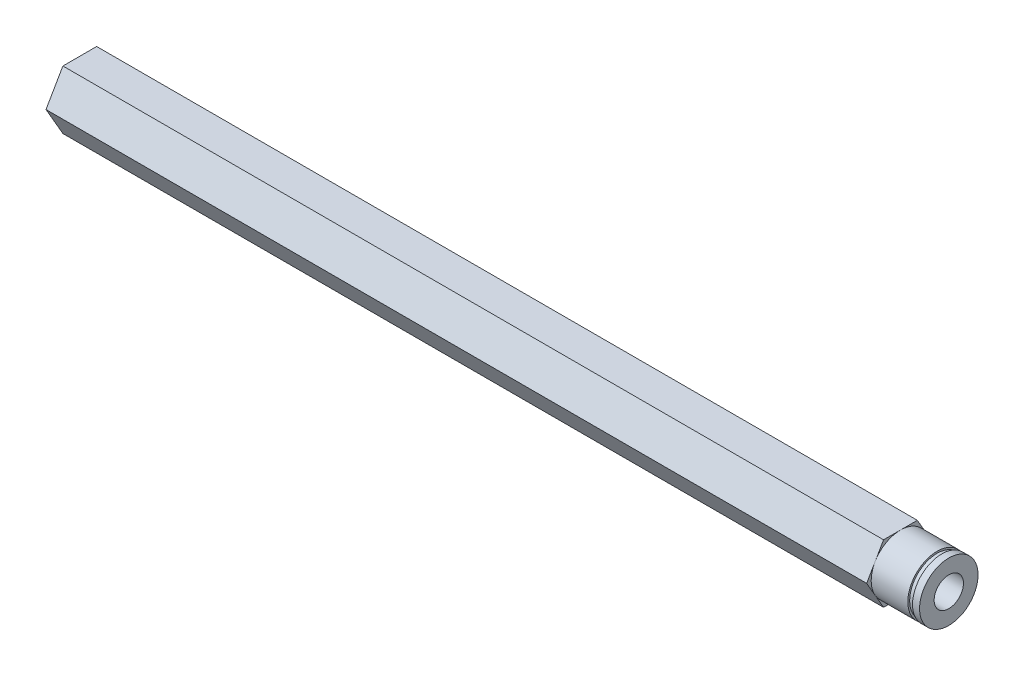
ISO-10303-21;
HEADER;
FILE_DESCRIPTION(('STEP AP214'),'2;1');
FILE_NAME('part.step','',(''),(''),'','','');
FILE_SCHEMA(('AUTOMOTIVE_DESIGN { 1 0 10303 214 1 1 1 1 }'));
ENDSEC;
DATA;
#1=APPLICATION_CONTEXT('core data for automotive mechanical design processes');
#2=APPLICATION_PROTOCOL_DEFINITION('international standard','automotive_design',2000,#1);
#3=PRODUCT_CONTEXT('',#1,'mechanical');
#4=PRODUCT('Part','Part','',(#3));
#5=PRODUCT_RELATED_PRODUCT_CATEGORY('part','',(#4));
#6=PRODUCT_DEFINITION_FORMATION('','',#4);
#7=PRODUCT_DEFINITION_CONTEXT('part definition',#1,'design');
#8=PRODUCT_DEFINITION('design','',#6,#7);
#9=PRODUCT_DEFINITION_SHAPE('','',#8);
#10=(LENGTH_UNIT() NAMED_UNIT(*) SI_UNIT(.MILLI.,.METRE.));
#11=(NAMED_UNIT(*) PLANE_ANGLE_UNIT() SI_UNIT($,.RADIAN.));
#12=(NAMED_UNIT(*) SI_UNIT($,.STERADIAN.) SOLID_ANGLE_UNIT());
#13=UNCERTAINTY_MEASURE_WITH_UNIT(LENGTH_MEASURE(1.E-05),#10,'distance_accuracy_value','');
#14=(GEOMETRIC_REPRESENTATION_CONTEXT(3) GLOBAL_UNCERTAINTY_ASSIGNED_CONTEXT((#13)) GLOBAL_UNIT_ASSIGNED_CONTEXT((#10,
#11,#12)) REPRESENTATION_CONTEXT('',''));
#15=CARTESIAN_POINT('',(0.,0.,0.));
#16=DIRECTION('',(0.,0.,1.));
#17=DIRECTION('',(1.,0.,0.));
#18=AXIS2_PLACEMENT_3D('',#15,#16,#17);
#19=CARTESIAN_POINT('',(-5.3975,0.,0.));
#20=DIRECTION('',(1.,0.,0.));
#21=DIRECTION('',(0.,0.,-1.));
#22=AXIS2_PLACEMENT_3D('',#19,#20,#21);
#23=PLANE('',#22);
#24=CARTESIAN_POINT('',(-5.3975,0.,0.));
#25=DIRECTION('',(1.,0.,0.));
#26=DIRECTION('',(0.,0.,-1.));
#27=AXIS2_PLACEMENT_3D('',#24,#25,#26);
#28=CIRCLE('',#27,3.175);
#29=CARTESIAN_POINT('',(-5.3975,0.,-3.175));
#30=VERTEX_POINT('',#29);
#31=EDGE_CURVE('E19',#30,#30,#28,.T.);
#32=ORIENTED_EDGE('',*,*,#31,.T.);
#33=EDGE_LOOP('',(#32));
#34=FACE_BOUND('',#33,.T.);
#35=ADVANCED_FACE('F16',(#34),#23,.T.);
#36=CARTESIAN_POINT('',(-5.3975,0.,0.));
#37=DIRECTION('',(1.,0.,0.));
#38=DIRECTION('',(0.,0.,-1.));
#39=AXIS2_PLACEMENT_3D('',#36,#37,#38);
#40=CYLINDRICAL_SURFACE('',#39,3.175);
#41=CARTESIAN_POINT('',(10.4775,0.,0.));
#42=DIRECTION('',(1.,0.,0.));
#43=DIRECTION('',(0.,0.,-1.));
#44=AXIS2_PLACEMENT_3D('',#41,#42,#43);
#45=CIRCLE('',#44,3.175);
#46=CARTESIAN_POINT('',(10.4775,0.,-3.175));
#47=VERTEX_POINT('',#46);
#48=EDGE_CURVE('E180',#47,#47,#45,.F.);
#49=ORIENTED_EDGE('',*,*,#48,.F.);
#50=EDGE_LOOP('',(#49));
#51=FACE_BOUND('',#50,.T.);
#52=ORIENTED_EDGE('',*,*,#31,.F.);
#53=EDGE_LOOP('',(#52));
#54=FACE_BOUND('',#53,.T.);
#55=ADVANCED_FACE('F192',(#51,#54),#40,.F.);
#56=CARTESIAN_POINT('',(10.4775,0.,0.));
#57=DIRECTION('',(1.,0.,0.));
#58=DIRECTION('',(0.,0.,-1.));
#59=AXIS2_PLACEMENT_3D('',#56,#57,#58);
#60=PLANE('',#59);
#61=CARTESIAN_POINT('',(10.4775,0.,0.));
#62=DIRECTION('',(-1.,0.,0.));
#63=DIRECTION('',(0.,0.,1.));
#64=AXIS2_PLACEMENT_3D('',#61,#62,#63);
#65=CIRCLE('',#64,6.3373);
#66=CARTESIAN_POINT('',(10.4775,0.,6.3373));
#67=VERTEX_POINT('',#66);
#68=EDGE_CURVE('E177',#67,#67,#65,.T.);
#69=ORIENTED_EDGE('',*,*,#68,.F.);
#70=EDGE_LOOP('',(#69));
#71=FACE_BOUND('',#70,.T.);
#72=ORIENTED_EDGE('',*,*,#48,.T.);
#73=EDGE_LOOP('',(#72));
#74=FACE_BOUND('',#73,.T.);
#75=ADVANCED_FACE('F194',(#71,#74),#60,.T.);
#76=CARTESIAN_POINT('',(10.4775,0.,0.));
#77=DIRECTION('',(-1.,0.,0.));
#78=DIRECTION('',(0.,0.,1.));
#79=AXIS2_PLACEMENT_3D('',#76,#77,#78);
#80=CYLINDRICAL_SURFACE('',#79,6.3373);
#81=ORIENTED_EDGE('',*,*,#68,.T.);
#82=EDGE_LOOP('',(#81));
#83=FACE_BOUND('',#82,.T.);
#84=CARTESIAN_POINT('',(8.9535,0.,0.));
#85=DIRECTION('',(-1.,0.,0.));
#86=DIRECTION('',(0.,0.,1.));
#87=AXIS2_PLACEMENT_3D('',#84,#85,#86);
#88=CIRCLE('',#87,6.3373);
#89=CARTESIAN_POINT('',(8.9535,0.,6.3373));
#90=VERTEX_POINT('',#89);
#91=EDGE_CURVE('E173',#90,#90,#88,.F.);
#92=ORIENTED_EDGE('',*,*,#91,.T.);
#93=EDGE_LOOP('',(#92));
#94=FACE_BOUND('',#93,.T.);
#95=ADVANCED_FACE('F201',(#83,#94),#80,.T.);
#96=CARTESIAN_POINT('',(8.9535,0.,0.));
#97=DIRECTION('',(1.,0.,0.));
#98=DIRECTION('',(0.,0.,-1.));
#99=AXIS2_PLACEMENT_3D('',#96,#97,#98);
#100=PLANE('',#99);
#101=ORIENTED_EDGE('',*,*,#91,.F.);
#102=EDGE_LOOP('',(#101));
#103=FACE_BOUND('',#102,.T.);
#104=CARTESIAN_POINT('',(8.9535,0.,0.));
#105=DIRECTION('',(-1.,0.,0.));
#106=DIRECTION('',(0.,0.,1.));
#107=AXIS2_PLACEMENT_3D('',#104,#105,#106);
#108=CIRCLE('',#107,5.9436);
#109=CARTESIAN_POINT('',(8.9535,0.,5.9436));
#110=VERTEX_POINT('',#109);
#111=EDGE_CURVE('E169',#110,#110,#108,.T.);
#112=ORIENTED_EDGE('',*,*,#111,.F.);
#113=EDGE_LOOP('',(#112));
#114=FACE_BOUND('',#113,.T.);
#115=ADVANCED_FACE('F263',(#103,#114),#100,.F.);
#116=CARTESIAN_POINT('',(8.9535,0.,0.));
#117=DIRECTION('',(-1.,0.,0.));
#118=DIRECTION('',(0.,0.,1.));
#119=AXIS2_PLACEMENT_3D('',#116,#117,#118);
#120=CYLINDRICAL_SURFACE('',#119,5.9436);
#121=CARTESIAN_POINT('',(7.9375,0.,0.));
#122=DIRECTION('',(-1.,0.,0.));
#123=DIRECTION('',(0.,0.,1.));
#124=AXIS2_PLACEMENT_3D('',#121,#122,#123);
#125=CIRCLE('',#124,5.9436);
#126=CARTESIAN_POINT('',(7.9375,0.,5.9436));
#127=VERTEX_POINT('',#126);
#128=EDGE_CURVE('E164',#127,#127,#125,.T.);
#129=ORIENTED_EDGE('',*,*,#128,.F.);
#130=EDGE_LOOP('',(#129));
#131=FACE_BOUND('',#130,.T.);
#132=ORIENTED_EDGE('',*,*,#111,.T.);
#133=EDGE_LOOP('',(#132));
#134=FACE_BOUND('',#133,.T.);
#135=ADVANCED_FACE('F260',(#131,#134),#120,.T.);
#136=CARTESIAN_POINT('',(0.,0.,0.));
#137=DIRECTION('',(-1.,0.,0.));
#138=DIRECTION('',(0.,0.,1.));
#139=AXIS2_PLACEMENT_3D('',#136,#137,#138);
#140=PLANE('',#139);
#141=DIRECTION('',(0.,0.866025403784439,0.499999999999999));
#142=VECTOR('',#141,1.);
#143=CARTESIAN_POINT('',(0.,-6.3373,3.65884186093542));
#144=LINE('',#143,#142);
#145=CARTESIAN_POINT('',(0.,-3.16865,5.48826279140312));
#146=VERTEX_POINT('',#145);
#147=CARTESIAN_POINT('',(0.,-6.3373,3.65884186093542));
#148=VERTEX_POINT('',#147);
#149=EDGE_CURVE('E78',#146,#148,#144,.F.);
#150=ORIENTED_EDGE('',*,*,#149,.T.);
#151=DIRECTION('',(0.,0.,1.));
#152=VECTOR('',#151,1.);
#153=CARTESIAN_POINT('',(0.,-6.3373,-3.65884186093542));
#154=LINE('',#153,#152);
#155=CARTESIAN_POINT('',(0.,-6.3373,0.));
#156=VERTEX_POINT('',#155);
#157=EDGE_CURVE('E70',#148,#156,#154,.F.);
#158=ORIENTED_EDGE('',*,*,#157,.T.);
#159=CARTESIAN_POINT('',(0.,0.,0.));
#160=DIRECTION('',(-1.,0.,0.));
#161=DIRECTION('',(0.,0.,1.));
#162=AXIS2_PLACEMENT_3D('',#159,#160,#161);
#163=CIRCLE('',#162,6.3373);
#164=EDGE_CURVE('E160',#146,#156,#163,.F.);
#165=ORIENTED_EDGE('',*,*,#164,.F.);
#166=EDGE_LOOP('',(#150,#158,#165));
#167=FACE_BOUND('',#166,.T.);
#168=ADVANCED_FACE('F256',(#167),#140,.F.);
#169=CARTESIAN_POINT('',(7.9375,0.,0.));
#170=DIRECTION('',(1.,0.,0.));
#171=DIRECTION('',(0.,0.,-1.));
#172=AXIS2_PLACEMENT_3D('',#169,#170,#171);
#173=PLANE('',#172);
#174=CARTESIAN_POINT('',(7.9375,0.,0.));
#175=DIRECTION('',(-1.,0.,0.));
#176=DIRECTION('',(0.,0.,1.));
#177=AXIS2_PLACEMENT_3D('',#174,#175,#176);
#178=CIRCLE('',#177,6.3373);
#179=CARTESIAN_POINT('',(7.9375,0.,6.3373));
#180=VERTEX_POINT('',#179);
#181=EDGE_CURVE('E153',#180,#180,#178,.T.);
#182=ORIENTED_EDGE('',*,*,#181,.F.);
#183=EDGE_LOOP('',(#182));
#184=FACE_BOUND('',#183,.T.);
#185=ORIENTED_EDGE('',*,*,#128,.T.);
#186=EDGE_LOOP('',(#185));
#187=FACE_BOUND('',#186,.T.);
#188=ADVANCED_FACE('F252',(#184,#187),#173,.T.);
#189=CARTESIAN_POINT('',(0.,0.,0.));
#190=DIRECTION('',(-1.,0.,0.));
#191=DIRECTION('',(0.,0.,1.));
#192=AXIS2_PLACEMENT_3D('',#189,#190,#191);
#193=PLANE('',#192);
#194=DIRECTION('',(0.,0.866025403784439,-0.5));
#195=VECTOR('',#194,1.);
#196=CARTESIAN_POINT('',(0.,0.,7.31768372187083));
#197=LINE('',#196,#195);
#198=CARTESIAN_POINT('',(0.,3.16865,5.48826279140312));
#199=VERTEX_POINT('',#198);
#200=CARTESIAN_POINT('',(0.,0.,7.31768372187083));
#201=VERTEX_POINT('',#200);
#202=EDGE_CURVE('E423',#199,#201,#197,.F.);
#203=ORIENTED_EDGE('',*,*,#202,.T.);
#204=DIRECTION('',(0.,0.866025403784439,0.499999999999999));
#205=VECTOR('',#204,1.);
#206=CARTESIAN_POINT('',(0.,-6.3373,3.65884186093542));
#207=LINE('',#206,#205);
#208=EDGE_CURVE('E168',#201,#146,#207,.F.);
#209=ORIENTED_EDGE('',*,*,#208,.T.);
#210=CARTESIAN_POINT('',(0.,0.,0.));
#211=DIRECTION('',(-1.,0.,0.));
#212=DIRECTION('',(0.,0.,1.));
#213=AXIS2_PLACEMENT_3D('',#210,#211,#212);
#214=CIRCLE('',#213,6.3373);
#215=EDGE_CURVE('E145',#199,#146,#214,.F.);
#216=ORIENTED_EDGE('',*,*,#215,.F.);
#217=EDGE_LOOP('',(#203,#209,#216));
#218=FACE_BOUND('',#217,.T.);
#219=ADVANCED_FACE('F248',(#218),#193,.F.);
#220=CARTESIAN_POINT('',(0.,0.,0.));
#221=DIRECTION('',(-1.,0.,0.));
#222=DIRECTION('',(0.,0.,1.));
#223=AXIS2_PLACEMENT_3D('',#220,#221,#222);
#224=PLANE('',#223);
#225=DIRECTION('',(0.,0.,-1.));
#226=VECTOR('',#225,1.);
#227=CARTESIAN_POINT('',(0.,6.3373,3.65884186093541));
#228=LINE('',#227,#226);
#229=CARTESIAN_POINT('',(0.,6.3373,0.));
#230=VERTEX_POINT('',#229);
#231=CARTESIAN_POINT('',(0.,6.3373,3.65884186093541));
#232=VERTEX_POINT('',#231);
#233=EDGE_CURVE('E128',#230,#232,#228,.F.);
#234=ORIENTED_EDGE('',*,*,#233,.T.);
#235=DIRECTION('',(0.,0.866025403784439,-0.5));
#236=VECTOR('',#235,1.);
#237=CARTESIAN_POINT('',(0.,0.,7.31768372187083));
#238=LINE('',#237,#236);
#239=EDGE_CURVE('E440',#232,#199,#238,.F.);
#240=ORIENTED_EDGE('',*,*,#239,.T.);
#241=CARTESIAN_POINT('',(0.,0.,0.));
#242=DIRECTION('',(-1.,0.,0.));
#243=DIRECTION('',(0.,0.,1.));
#244=AXIS2_PLACEMENT_3D('',#241,#242,#243);
#245=CIRCLE('',#244,6.3373);
#246=EDGE_CURVE('E150',#230,#199,#245,.F.);
#247=ORIENTED_EDGE('',*,*,#246,.F.);
#248=EDGE_LOOP('',(#234,#240,#247));
#249=FACE_BOUND('',#248,.T.);
#250=ADVANCED_FACE('F244',(#249),#224,.F.);
#251=CARTESIAN_POINT('',(-177.8,-6.3373,3.65884186093542));
#252=DIRECTION('',(0.,0.499999999999999,-0.866025403784439));
#253=DIRECTION('',(0.,0.866025403784439,0.499999999999999));
#254=AXIS2_PLACEMENT_3D('',#251,#252,#253);
#255=PLANE('',#254);
#256=ORIENTED_EDGE('',*,*,#208,.F.);
#257=DIRECTION('',(1.,0.,0.));
#258=VECTOR('',#257,1.);
#259=CARTESIAN_POINT('',(-177.8,0.,7.31768372187083));
#260=LINE('',#259,#258);
#261=CARTESIAN_POINT('',(-177.8,0.,7.31768372187083));
#262=VERTEX_POINT('',#261);
#263=EDGE_CURVE('E445',#201,#262,#260,.F.);
#264=ORIENTED_EDGE('',*,*,#263,.T.);
#265=DIRECTION('',(0.,0.866025403784439,0.499999999999999));
#266=VECTOR('',#265,1.);
#267=CARTESIAN_POINT('',(-177.8,-6.3373,3.65884186093542));
#268=LINE('',#267,#266);
#269=CARTESIAN_POINT('',(-177.8,-6.3373,3.65884186093542));
#270=VERTEX_POINT('',#269);
#271=EDGE_CURVE('E499',#270,#262,#268,.T.);
#272=ORIENTED_EDGE('',*,*,#271,.F.);
#273=DIRECTION('',(1.,0.,0.));
#274=VECTOR('',#273,1.);
#275=CARTESIAN_POINT('',(-177.8,-6.3373,3.65884186093542));
#276=LINE('',#275,#274);
#277=EDGE_CURVE('E418',#270,#148,#276,.T.);
#278=ORIENTED_EDGE('',*,*,#277,.T.);
#279=ORIENTED_EDGE('',*,*,#149,.F.);
#280=EDGE_LOOP('',(#256,#264,#272,#278,#279));
#281=FACE_BOUND('',#280,.T.);
#282=ADVANCED_FACE('F241',(#281),#255,.F.);
#283=CARTESIAN_POINT('',(-177.8,0.,7.31768372187083));
#284=DIRECTION('',(0.,-0.5,-0.866025403784439));
#285=DIRECTION('',(0.,0.866025403784439,-0.5));
#286=AXIS2_PLACEMENT_3D('',#283,#284,#285);
#287=PLANE('',#286);
#288=ORIENTED_EDGE('',*,*,#239,.F.);
#289=DIRECTION('',(1.,0.,0.));
#290=VECTOR('',#289,1.);
#291=CARTESIAN_POINT('',(-177.8,6.3373,3.65884186093541));
#292=LINE('',#291,#290);
#293=CARTESIAN_POINT('',(-177.8,6.3373,3.65884186093541));
#294=VERTEX_POINT('',#293);
#295=EDGE_CURVE('E149',#232,#294,#292,.F.);
#296=ORIENTED_EDGE('',*,*,#295,.T.);
#297=DIRECTION('',(0.,0.866025403784438,-0.5));
#298=VECTOR('',#297,1.);
#299=CARTESIAN_POINT('',(-177.8,0.,7.31768372187083));
#300=LINE('',#299,#298);
#301=EDGE_CURVE('E495',#262,#294,#300,.T.);
#302=ORIENTED_EDGE('',*,*,#301,.F.);
#303=ORIENTED_EDGE('',*,*,#263,.F.);
#304=ORIENTED_EDGE('',*,*,#202,.F.);
#305=EDGE_LOOP('',(#288,#296,#302,#303,#304));
#306=FACE_BOUND('',#305,.T.);
#307=ADVANCED_FACE('F237',(#306),#287,.F.);
#308=CARTESIAN_POINT('',(-177.8,-6.3373,-3.65884186093542));
#309=DIRECTION('',(0.,1.,0.));
#310=DIRECTION('',(0.,0.,1.));
#311=AXIS2_PLACEMENT_3D('',#308,#309,#310);
#312=PLANE('',#311);
#313=ORIENTED_EDGE('',*,*,#157,.F.);
#314=ORIENTED_EDGE('',*,*,#277,.F.);
#315=DIRECTION('',(0.,0.,1.));
#316=VECTOR('',#315,1.);
#317=CARTESIAN_POINT('',(-177.8,-6.3373,0.));
#318=LINE('',#317,#316);
#319=CARTESIAN_POINT('',(-177.8,-6.3373,-3.65884186093541));
#320=VERTEX_POINT('',#319);
#321=EDGE_CURVE('E452',#320,#270,#318,.T.);
#322=ORIENTED_EDGE('',*,*,#321,.F.);
#323=DIRECTION('',(1.,0.,0.));
#324=VECTOR('',#323,1.);
#325=CARTESIAN_POINT('',(-177.8,-6.3373,-3.65884186093541));
#326=LINE('',#325,#324);
#327=CARTESIAN_POINT('',(0.,-6.3373,-3.65884186093541));
#328=VERTEX_POINT('',#327);
#329=EDGE_CURVE('E433',#320,#328,#326,.T.);
#330=ORIENTED_EDGE('',*,*,#329,.T.);
#331=DIRECTION('',(0.,0.,1.));
#332=VECTOR('',#331,1.);
#333=CARTESIAN_POINT('',(0.,-6.3373,0.));
#334=LINE('',#333,#332);
#335=EDGE_CURVE('E163',#328,#156,#334,.T.);
#336=ORIENTED_EDGE('',*,*,#335,.T.);
#337=EDGE_LOOP('',(#313,#314,#322,#330,#336));
#338=FACE_BOUND('',#337,.T.);
#339=ADVANCED_FACE('F233',(#338),#312,.F.);
#340=CARTESIAN_POINT('',(0.,0.,0.));
#341=DIRECTION('',(-1.,0.,0.));
#342=DIRECTION('',(0.,0.,1.));
#343=AXIS2_PLACEMENT_3D('',#340,#341,#342);
#344=PLANE('',#343);
#345=ORIENTED_EDGE('',*,*,#335,.F.);
#346=DIRECTION('',(0.,-0.866025403784439,0.5));
#347=VECTOR('',#346,1.);
#348=CARTESIAN_POINT('',(0.,0.,-7.31768372187083));
#349=LINE('',#348,#347);
#350=CARTESIAN_POINT('',(0.,-3.16865,-5.48826279140312));
#351=VERTEX_POINT('',#350);
#352=EDGE_CURVE('E437',#328,#351,#349,.F.);
#353=ORIENTED_EDGE('',*,*,#352,.T.);
#354=CARTESIAN_POINT('',(0.,0.,0.));
#355=DIRECTION('',(-1.,0.,0.));
#356=DIRECTION('',(0.,0.,1.));
#357=AXIS2_PLACEMENT_3D('',#354,#355,#356);
#358=CIRCLE('',#357,6.3373);
#359=EDGE_CURVE('E157',#156,#351,#358,.F.);
#360=ORIENTED_EDGE('',*,*,#359,.F.);
#361=EDGE_LOOP('',(#345,#353,#360));
#362=FACE_BOUND('',#361,.T.);
#363=ADVANCED_FACE('F230',(#362),#344,.F.);
#364=CARTESIAN_POINT('',(7.9375,0.,0.));
#365=DIRECTION('',(-1.,0.,0.));
#366=DIRECTION('',(0.,0.,1.));
#367=AXIS2_PLACEMENT_3D('',#364,#365,#366);
#368=CYLINDRICAL_SURFACE('',#367,6.3373);
#369=CARTESIAN_POINT('',(0.,0.,0.));
#370=DIRECTION('',(-1.,0.,0.));
#371=DIRECTION('',(0.,0.,1.));
#372=AXIS2_PLACEMENT_3D('',#369,#370,#371);
#373=CIRCLE('',#372,6.3373);
#374=CARTESIAN_POINT('',(0.,3.16865,-5.48826279140313));
#375=VERTEX_POINT('',#374);
#376=EDGE_CURVE('E39',#351,#375,#373,.F.);
#377=ORIENTED_EDGE('',*,*,#376,.T.);
#378=CARTESIAN_POINT('',(0.,0.,0.));
#379=DIRECTION('',(-1.,0.,0.));
#380=DIRECTION('',(0.,0.,1.));
#381=AXIS2_PLACEMENT_3D('',#378,#379,#380);
#382=CIRCLE('',#381,6.3373);
#383=EDGE_CURVE('E121',#375,#230,#382,.F.);
#384=ORIENTED_EDGE('',*,*,#383,.T.);
#385=ORIENTED_EDGE('',*,*,#246,.T.);
#386=ORIENTED_EDGE('',*,*,#215,.T.);
#387=ORIENTED_EDGE('',*,*,#164,.T.);
#388=ORIENTED_EDGE('',*,*,#359,.T.);
#389=EDGE_LOOP('',(#377,#384,#385,#386,#387,#388));
#390=FACE_BOUND('',#389,.T.);
#391=ORIENTED_EDGE('',*,*,#181,.T.);
#392=EDGE_LOOP('',(#391));
#393=FACE_BOUND('',#392,.T.);
#394=ADVANCED_FACE('F227',(#390,#393),#368,.T.);
#395=CARTESIAN_POINT('',(-177.8,6.3373,3.65884186093541));
#396=DIRECTION('',(0.,-1.,0.));
#397=DIRECTION('',(0.,0.,-1.));
#398=AXIS2_PLACEMENT_3D('',#395,#396,#397);
#399=PLANE('',#398);
#400=DIRECTION('',(0.,0.,1.));
#401=VECTOR('',#400,1.);
#402=CARTESIAN_POINT('',(0.,6.3373,0.));
#403=LINE('',#402,#401);
#404=CARTESIAN_POINT('',(0.,6.3373,-3.65884186093542));
#405=VERTEX_POINT('',#404);
#406=EDGE_CURVE('E124',#230,#405,#403,.F.);
#407=ORIENTED_EDGE('',*,*,#406,.T.);
#408=DIRECTION('',(1.,0.,0.));
#409=VECTOR('',#408,1.);
#410=CARTESIAN_POINT('',(-177.8,6.3373,-3.65884186093542));
#411=LINE('',#410,#409);
#412=CARTESIAN_POINT('',(-177.8,6.3373,-3.65884186093542));
#413=VERTEX_POINT('',#412);
#414=EDGE_CURVE('E110',#405,#413,#411,.F.);
#415=ORIENTED_EDGE('',*,*,#414,.T.);
#416=DIRECTION('',(0.,0.,1.));
#417=VECTOR('',#416,1.);
#418=CARTESIAN_POINT('',(-177.8,6.3373,0.));
#419=LINE('',#418,#417);
#420=EDGE_CURVE('E498',#294,#413,#419,.F.);
#421=ORIENTED_EDGE('',*,*,#420,.F.);
#422=ORIENTED_EDGE('',*,*,#295,.F.);
#423=ORIENTED_EDGE('',*,*,#233,.F.);
#424=EDGE_LOOP('',(#407,#415,#421,#422,#423));
#425=FACE_BOUND('',#424,.T.);
#426=ADVANCED_FACE('F125',(#425),#399,.F.);
#427=CARTESIAN_POINT('',(-177.8,0.,0.));
#428=DIRECTION('',(-1.,0.,0.));
#429=DIRECTION('',(0.,0.,1.));
#430=AXIS2_PLACEMENT_3D('',#427,#428,#429);
#431=PLANE('',#430);
#432=DIRECTION('',(0.,-0.866025403784439,0.5));
#433=VECTOR('',#432,1.);
#434=CARTESIAN_POINT('',(-177.8,0.,-7.31768372187083));
#435=LINE('',#434,#433);
#436=CARTESIAN_POINT('',(-177.8,0.,-7.31768372187083));
#437=VERTEX_POINT('',#436);
#438=EDGE_CURVE('E438',#437,#320,#435,.T.);
#439=ORIENTED_EDGE('',*,*,#438,.T.);
#440=ORIENTED_EDGE('',*,*,#321,.T.);
#441=ORIENTED_EDGE('',*,*,#271,.T.);
#442=ORIENTED_EDGE('',*,*,#301,.T.);
#443=ORIENTED_EDGE('',*,*,#420,.T.);
#444=DIRECTION('',(0.,-0.866025403784439,-0.5));
#445=VECTOR('',#444,1.);
#446=CARTESIAN_POINT('',(-177.8,6.3373,-3.65884186093542));
#447=LINE('',#446,#445);
#448=EDGE_CURVE('E117',#413,#437,#447,.T.);
#449=ORIENTED_EDGE('',*,*,#448,.T.);
#450=EDGE_LOOP('',(#439,#440,#441,#442,#443,#449));
#451=FACE_BOUND('',#450,.T.);
#452=ADVANCED_FACE('F221',(#451),#431,.T.);
#453=CARTESIAN_POINT('',(-177.8,0.,-7.31768372187083));
#454=DIRECTION('',(0.,0.5,0.866025403784439));
#455=DIRECTION('',(0.,-0.866025403784439,0.5));
#456=AXIS2_PLACEMENT_3D('',#453,#454,#455);
#457=PLANE('',#456);
#458=ORIENTED_EDGE('',*,*,#352,.F.);
#459=ORIENTED_EDGE('',*,*,#329,.F.);
#460=ORIENTED_EDGE('',*,*,#438,.F.);
#461=DIRECTION('',(1.,0.,0.));
#462=VECTOR('',#461,1.);
#463=CARTESIAN_POINT('',(-177.8,0.,-7.31768372187083));
#464=LINE('',#463,#462);
#465=CARTESIAN_POINT('',(0.,0.,-7.31768372187083));
#466=VERTEX_POINT('',#465);
#467=EDGE_CURVE('E427',#437,#466,#464,.T.);
#468=ORIENTED_EDGE('',*,*,#467,.T.);
#469=DIRECTION('',(0.,-0.866025403784438,0.5));
#470=VECTOR('',#469,1.);
#471=CARTESIAN_POINT('',(0.,0.,-7.31768372187083));
#472=LINE('',#471,#470);
#473=EDGE_CURVE('E144',#466,#351,#472,.T.);
#474=ORIENTED_EDGE('',*,*,#473,.T.);
#475=EDGE_LOOP('',(#458,#459,#460,#468,#474));
#476=FACE_BOUND('',#475,.T.);
#477=ADVANCED_FACE('F217',(#476),#457,.F.);
#478=CARTESIAN_POINT('',(0.,0.,0.));
#479=DIRECTION('',(-1.,0.,0.));
#480=DIRECTION('',(0.,0.,1.));
#481=AXIS2_PLACEMENT_3D('',#478,#479,#480);
#482=PLANE('',#481);
#483=ORIENTED_EDGE('',*,*,#473,.F.);
#484=DIRECTION('',(0.,-0.866025403784439,-0.5));
#485=VECTOR('',#484,1.);
#486=CARTESIAN_POINT('',(0.,6.3373,-3.65884186093542));
#487=LINE('',#486,#485);
#488=EDGE_CURVE('E26',#466,#375,#487,.F.);
#489=ORIENTED_EDGE('',*,*,#488,.T.);
#490=ORIENTED_EDGE('',*,*,#376,.F.);
#491=EDGE_LOOP('',(#483,#489,#490));
#492=FACE_BOUND('',#491,.T.);
#493=ADVANCED_FACE('F212',(#492),#482,.F.);
#494=CARTESIAN_POINT('',(0.,0.,0.));
#495=DIRECTION('',(-1.,0.,0.));
#496=DIRECTION('',(0.,0.,1.));
#497=AXIS2_PLACEMENT_3D('',#494,#495,#496);
#498=PLANE('',#497);
#499=DIRECTION('',(0.,-0.866025403784439,-0.5));
#500=VECTOR('',#499,1.);
#501=CARTESIAN_POINT('',(0.,6.3373,-3.65884186093542));
#502=LINE('',#501,#500);
#503=EDGE_CURVE('E11',#375,#405,#502,.F.);
#504=ORIENTED_EDGE('',*,*,#503,.T.);
#505=ORIENTED_EDGE('',*,*,#406,.F.);
#506=ORIENTED_EDGE('',*,*,#383,.F.);
#507=EDGE_LOOP('',(#504,#505,#506));
#508=FACE_BOUND('',#507,.T.);
#509=ADVANCED_FACE('F133',(#508),#498,.F.);
#510=CARTESIAN_POINT('',(-177.8,6.3373,-3.65884186093542));
#511=DIRECTION('',(0.,-0.5,0.866025403784439));
#512=DIRECTION('',(0.,-0.866025403784439,-0.5));
#513=AXIS2_PLACEMENT_3D('',#510,#511,#512);
#514=PLANE('',#513);
#515=ORIENTED_EDGE('',*,*,#488,.F.);
#516=ORIENTED_EDGE('',*,*,#467,.F.);
#517=ORIENTED_EDGE('',*,*,#448,.F.);
#518=ORIENTED_EDGE('',*,*,#414,.F.);
#519=ORIENTED_EDGE('',*,*,#503,.F.);
#520=EDGE_LOOP('',(#515,#516,#517,#518,#519));
#521=FACE_BOUND('',#520,.T.);
#522=ADVANCED_FACE('F113',(#521),#514,.F.);
#523=CLOSED_SHELL('',(#35,#55,#75,#95,#115,#135,#168,#188,#219,#250,#282,#307,#339,#363,#394,
#426,#452,#477,#493,#509,#522));
#524=MANIFOLD_SOLID_BREP('B1',#523);
#525=ADVANCED_BREP_SHAPE_REPRESENTATION('',(#18,#524),#14);
#526=SHAPE_DEFINITION_REPRESENTATION(#9,#525);
ENDSEC;
END-ISO-10303-21;
